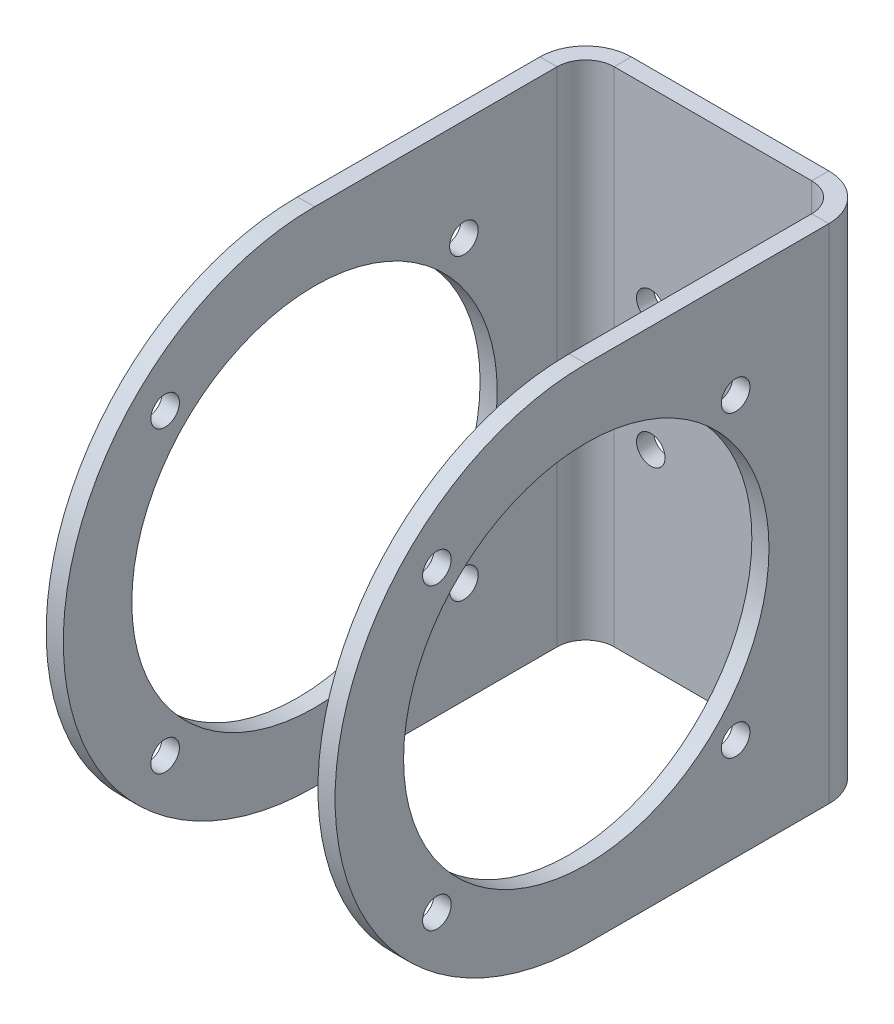
ISO-10303-21;
HEADER;
FILE_DESCRIPTION(('STEP AP214'),'2;1');
FILE_NAME('part.step','',(''),(''),'','','');
FILE_SCHEMA(('AUTOMOTIVE_DESIGN { 1 0 10303 214 1 1 1 1 }'));
ENDSEC;
DATA;
#1=APPLICATION_CONTEXT('core data for automotive mechanical design processes');
#2=APPLICATION_PROTOCOL_DEFINITION('international standard','automotive_design',2000,#1);
#3=PRODUCT_CONTEXT('',#1,'mechanical');
#4=PRODUCT('Part','Part','',(#3));
#5=PRODUCT_RELATED_PRODUCT_CATEGORY('part','',(#4));
#6=PRODUCT_DEFINITION_FORMATION('','',#4);
#7=PRODUCT_DEFINITION_CONTEXT('part definition',#1,'design');
#8=PRODUCT_DEFINITION('design','',#6,#7);
#9=PRODUCT_DEFINITION_SHAPE('','',#8);
#10=(LENGTH_UNIT() NAMED_UNIT(*) SI_UNIT(.MILLI.,.METRE.));
#11=(NAMED_UNIT(*) PLANE_ANGLE_UNIT() SI_UNIT($,.RADIAN.));
#12=(NAMED_UNIT(*) SI_UNIT($,.STERADIAN.) SOLID_ANGLE_UNIT());
#13=UNCERTAINTY_MEASURE_WITH_UNIT(LENGTH_MEASURE(1.E-05),#10,'distance_accuracy_value','');
#14=(GEOMETRIC_REPRESENTATION_CONTEXT(3) GLOBAL_UNCERTAINTY_ASSIGNED_CONTEXT((#13)) GLOBAL_UNIT_ASSIGNED_CONTEXT((#10,
#11,#12)) REPRESENTATION_CONTEXT('',''));
#15=CARTESIAN_POINT('',(0.,0.,0.));
#16=DIRECTION('',(0.,0.,1.));
#17=DIRECTION('',(1.,0.,0.));
#18=AXIS2_PLACEMENT_3D('',#15,#16,#17);
#19=CARTESIAN_POINT('',(-35.,22.,3.2));
#20=DIRECTION('',(0.,1.,0.));
#21=DIRECTION('',(-1.,0.,0.));
#22=AXIS2_PLACEMENT_3D('',#19,#20,#21);
#23=PLANE('',#22);
#24=DIRECTION('',(-1.,0.,0.));
#25=VECTOR('',#24,1.);
#26=CARTESIAN_POINT('',(-35.,22.,3.2));
#27=LINE('',#26,#25);
#28=CARTESIAN_POINT('',(8.65000000000001,22.,3.2));
#29=VERTEX_POINT('',#28);
#30=CARTESIAN_POINT('',(-8.65000000000001,22.,3.2));
#31=VERTEX_POINT('',#30);
#32=EDGE_CURVE('E318',#29,#31,#27,.T.);
#33=ORIENTED_EDGE('',*,*,#32,.F.);
#34=DIRECTION('',(0.,0.,-1.));
#35=VECTOR('',#34,1.);
#36=CARTESIAN_POINT('',(8.65000000000001,22.,3.2));
#37=LINE('',#36,#35);
#38=CARTESIAN_POINT('',(8.65000000000001,22.,1.7));
#39=VERTEX_POINT('',#38);
#40=EDGE_CURVE('E12',#29,#39,#37,.T.);
#41=ORIENTED_EDGE('',*,*,#40,.T.);
#42=DIRECTION('',(1.,0.,0.));
#43=VECTOR('',#42,1.);
#44=CARTESIAN_POINT('',(35.,22.,1.7));
#45=LINE('',#44,#43);
#46=CARTESIAN_POINT('',(-8.65000000000001,22.,1.7));
#47=VERTEX_POINT('',#46);
#48=EDGE_CURVE('E214',#39,#47,#45,.F.);
#49=ORIENTED_EDGE('',*,*,#48,.T.);
#50=DIRECTION('',(0.,0.,-1.));
#51=VECTOR('',#50,1.);
#52=CARTESIAN_POINT('',(-8.65000000000001,22.,3.2));
#53=LINE('',#52,#51);
#54=EDGE_CURVE('E243',#31,#47,#53,.T.);
#55=ORIENTED_EDGE('',*,*,#54,.F.);
#56=EDGE_LOOP('',(#33,#41,#49,#55));
#57=FACE_BOUND('',#56,.T.);
#58=ADVANCED_FACE('F47',(#57),#23,.T.);
#59=CARTESIAN_POINT('',(-35.,-22.,3.2));
#60=DIRECTION('',(0.,-1.,0.));
#61=DIRECTION('',(1.,0.,0.));
#62=AXIS2_PLACEMENT_3D('',#59,#60,#61);
#63=PLANE('',#62);
#64=DIRECTION('',(1.,0.,0.));
#65=VECTOR('',#64,1.);
#66=CARTESIAN_POINT('',(35.,-22.,1.7));
#67=LINE('',#66,#65);
#68=CARTESIAN_POINT('',(-8.65000000000001,-22.,1.7));
#69=VERTEX_POINT('',#68);
#70=CARTESIAN_POINT('',(8.65000000000002,-22.,1.7));
#71=VERTEX_POINT('',#70);
#72=EDGE_CURVE('E227',#69,#71,#67,.T.);
#73=ORIENTED_EDGE('',*,*,#72,.T.);
#74=DIRECTION('',(0.,0.,1.));
#75=VECTOR('',#74,1.);
#76=CARTESIAN_POINT('',(8.65000000000002,-22.,3.2));
#77=LINE('',#76,#75);
#78=CARTESIAN_POINT('',(8.65000000000002,-22.,3.2));
#79=VERTEX_POINT('',#78);
#80=EDGE_CURVE('E312',#71,#79,#77,.T.);
#81=ORIENTED_EDGE('',*,*,#80,.T.);
#82=DIRECTION('',(1.,0.,0.));
#83=VECTOR('',#82,1.);
#84=CARTESIAN_POINT('',(-35.,-22.,3.2));
#85=LINE('',#84,#83);
#86=CARTESIAN_POINT('',(-8.65,-22.,3.2));
#87=VERTEX_POINT('',#86);
#88=EDGE_CURVE('E50',#87,#79,#85,.T.);
#89=ORIENTED_EDGE('',*,*,#88,.F.);
#90=DIRECTION('',(0.,0.,1.));
#91=VECTOR('',#90,1.);
#92=CARTESIAN_POINT('',(-8.65,-22.,3.2));
#93=LINE('',#92,#91);
#94=EDGE_CURVE('E240',#69,#87,#93,.T.);
#95=ORIENTED_EDGE('',*,*,#94,.F.);
#96=EDGE_LOOP('',(#73,#81,#89,#95));
#97=FACE_BOUND('',#96,.T.);
#98=ADVANCED_FACE('F328',(#97),#63,.T.);
#99=CARTESIAN_POINT('',(35.,0.,3.2));
#100=DIRECTION('',(0.,0.,1.));
#101=DIRECTION('',(1.,0.,0.));
#102=AXIS2_PLACEMENT_3D('',#99,#100,#101);
#103=PLANE('',#102);
#104=CARTESIAN_POINT('',(-5.44472221513639,-5.44472221513645,3.2));
#105=DIRECTION('',(0.,0.,1.));
#106=DIRECTION('',(1.,0.,0.));
#107=AXIS2_PLACEMENT_3D('',#104,#105,#106);
#108=CIRCLE('',#107,1.25);
#109=CARTESIAN_POINT('',(-4.19472221513639,-5.44472221513645,3.2));
#110=VERTEX_POINT('',#109);
#111=EDGE_CURVE('E237',#110,#110,#108,.T.);
#112=ORIENTED_EDGE('',*,*,#111,.F.);
#113=EDGE_LOOP('',(#112));
#114=FACE_BOUND('',#113,.T.);
#115=CARTESIAN_POINT('',(5.44472221513639,5.44472221513645,3.2));
#116=DIRECTION('',(0.,0.,1.));
#117=DIRECTION('',(1.,0.,0.));
#118=AXIS2_PLACEMENT_3D('',#115,#116,#117);
#119=CIRCLE('',#118,1.25);
#120=CARTESIAN_POINT('',(6.69472221513638,5.44472221513645,3.2));
#121=VERTEX_POINT('',#120);
#122=EDGE_CURVE('E234',#121,#121,#119,.T.);
#123=ORIENTED_EDGE('',*,*,#122,.F.);
#124=EDGE_LOOP('',(#123));
#125=FACE_BOUND('',#124,.T.);
#126=CARTESIAN_POINT('',(-5.44472221513645,5.44472221513639,3.2));
#127=DIRECTION('',(0.,0.,1.));
#128=DIRECTION('',(1.,0.,0.));
#129=AXIS2_PLACEMENT_3D('',#126,#127,#128);
#130=CIRCLE('',#129,1.25);
#131=CARTESIAN_POINT('',(-4.19472221513645,5.44472221513639,3.2));
#132=VERTEX_POINT('',#131);
#133=EDGE_CURVE('E231',#132,#132,#130,.T.);
#134=ORIENTED_EDGE('',*,*,#133,.F.);
#135=EDGE_LOOP('',(#134));
#136=FACE_BOUND('',#135,.T.);
#137=CARTESIAN_POINT('',(5.44472221513645,-5.44472221513639,3.2));
#138=DIRECTION('',(0.,0.,1.));
#139=DIRECTION('',(1.,0.,0.));
#140=AXIS2_PLACEMENT_3D('',#137,#138,#139);
#141=CIRCLE('',#140,1.25);
#142=CARTESIAN_POINT('',(6.69472221513645,-5.44472221513639,3.2));
#143=VERTEX_POINT('',#142);
#144=EDGE_CURVE('E228',#143,#143,#141,.T.);
#145=ORIENTED_EDGE('',*,*,#144,.F.);
#146=EDGE_LOOP('',(#145));
#147=FACE_BOUND('',#146,.T.);
#148=ORIENTED_EDGE('',*,*,#88,.T.);
#149=DIRECTION('',(0.,1.,0.));
#150=VECTOR('',#149,1.);
#151=CARTESIAN_POINT('',(8.65000000000001,0.,3.2));
#152=LINE('',#151,#150);
#153=EDGE_CURVE('E303',#79,#29,#152,.T.);
#154=ORIENTED_EDGE('',*,*,#153,.T.);
#155=ORIENTED_EDGE('',*,*,#32,.T.);
#156=DIRECTION('',(0.,1.,0.));
#157=VECTOR('',#156,1.);
#158=CARTESIAN_POINT('',(-8.65000000000001,0.,3.2));
#159=LINE('',#158,#157);
#160=EDGE_CURVE('E206',#87,#31,#159,.T.);
#161=ORIENTED_EDGE('',*,*,#160,.F.);
#162=EDGE_LOOP('',(#148,#154,#155,#161));
#163=FACE_BOUND('',#162,.T.);
#164=ADVANCED_FACE('F324',(#114,#125,#136,#147,#163),#103,.T.);
#165=CARTESIAN_POINT('',(-11.1499999999999,-22.,26.9449119379166));
#166=DIRECTION('',(0.,-1.,0.));
#167=DIRECTION('',(0.,0.,-1.));
#168=AXIS2_PLACEMENT_3D('',#165,#166,#167);
#169=PLANE('',#168);
#170=DIRECTION('',(0.,0.,-1.));
#171=VECTOR('',#170,1.);
#172=CARTESIAN_POINT('',(-12.6500000000002,-22.,-43.0550880620834));
#173=LINE('',#172,#171);
#174=CARTESIAN_POINT('',(-12.6499999999999,-22.,26.9449119379166));
#175=VERTEX_POINT('',#174);
#176=CARTESIAN_POINT('',(-12.65,-22.,5.70000000000001));
#177=VERTEX_POINT('',#176);
#178=EDGE_CURVE('E282',#175,#177,#173,.T.);
#179=ORIENTED_EDGE('',*,*,#178,.T.);
#180=DIRECTION('',(1.,0.,0.));
#181=VECTOR('',#180,1.);
#182=CARTESIAN_POINT('',(-11.15,-22.,5.70000000000001));
#183=LINE('',#182,#181);
#184=CARTESIAN_POINT('',(-11.15,-22.,5.70000000000001));
#185=VERTEX_POINT('',#184);
#186=EDGE_CURVE('E295',#177,#185,#183,.T.);
#187=ORIENTED_EDGE('',*,*,#186,.T.);
#188=DIRECTION('',(0.,0.,-1.));
#189=VECTOR('',#188,1.);
#190=CARTESIAN_POINT('',(-11.1499999999999,-22.,26.9449119379166));
#191=LINE('',#190,#189);
#192=CARTESIAN_POINT('',(-11.1499999999999,-22.,26.9449119379166));
#193=VERTEX_POINT('',#192);
#194=EDGE_CURVE('E261',#193,#185,#191,.T.);
#195=ORIENTED_EDGE('',*,*,#194,.F.);
#196=DIRECTION('',(1.,0.,0.));
#197=VECTOR('',#196,1.);
#198=CARTESIAN_POINT('',(-11.1499999999999,-22.,26.9449119379166));
#199=LINE('',#198,#197);
#200=EDGE_CURVE('E268',#175,#193,#199,.T.);
#201=ORIENTED_EDGE('',*,*,#200,.F.);
#202=EDGE_LOOP('',(#179,#187,#195,#201));
#203=FACE_BOUND('',#202,.T.);
#204=ADVANCED_FACE('F386',(#203),#169,.T.);
#205=CARTESIAN_POINT('',(-11.1499999999999,22.,26.9449119379166));
#206=DIRECTION('',(0.,1.,0.));
#207=DIRECTION('',(0.,0.,1.));
#208=AXIS2_PLACEMENT_3D('',#205,#206,#207);
#209=PLANE('',#208);
#210=DIRECTION('',(0.,0.,1.));
#211=VECTOR('',#210,1.);
#212=CARTESIAN_POINT('',(-11.1499999999999,22.,26.9449119379166));
#213=LINE('',#212,#211);
#214=CARTESIAN_POINT('',(-11.15,22.,5.70000000000001));
#215=VERTEX_POINT('',#214);
#216=CARTESIAN_POINT('',(-11.1499999999999,22.,26.9449119379166));
#217=VERTEX_POINT('',#216);
#218=EDGE_CURVE('E257',#215,#217,#213,.T.);
#219=ORIENTED_EDGE('',*,*,#218,.F.);
#220=DIRECTION('',(-1.,0.,0.));
#221=VECTOR('',#220,1.);
#222=CARTESIAN_POINT('',(-11.15,22.,5.70000000000001));
#223=LINE('',#222,#221);
#224=CARTESIAN_POINT('',(-12.65,22.,5.70000000000001));
#225=VERTEX_POINT('',#224);
#226=EDGE_CURVE('E300',#215,#225,#223,.T.);
#227=ORIENTED_EDGE('',*,*,#226,.T.);
#228=DIRECTION('',(0.,0.,-1.));
#229=VECTOR('',#228,1.);
#230=CARTESIAN_POINT('',(-12.6500000000002,22.,-43.0550880620834));
#231=LINE('',#230,#229);
#232=CARTESIAN_POINT('',(-12.6499999999999,22.,26.9449119379166));
#233=VERTEX_POINT('',#232);
#234=EDGE_CURVE('E278',#225,#233,#231,.F.);
#235=ORIENTED_EDGE('',*,*,#234,.T.);
#236=DIRECTION('',(1.,0.,0.));
#237=VECTOR('',#236,1.);
#238=CARTESIAN_POINT('',(-11.1499999999999,22.,26.9449119379166));
#239=LINE('',#238,#237);
#240=EDGE_CURVE('E289',#233,#217,#239,.T.);
#241=ORIENTED_EDGE('',*,*,#240,.T.);
#242=EDGE_LOOP('',(#219,#227,#235,#241));
#243=FACE_BOUND('',#242,.T.);
#244=ADVANCED_FACE('F379',(#243),#209,.T.);
#245=CARTESIAN_POINT('',(-11.1500000000002,0.,-43.0550880620834));
#246=DIRECTION('',(1.,0.,0.));
#247=DIRECTION('',(0.,0.,-1.));
#248=AXIS2_PLACEMENT_3D('',#245,#246,#247);
#249=PLANE('',#248);
#250=CARTESIAN_POINT('',(-11.15,-13.0814754519511,13.8634364859655));
#251=DIRECTION('',(1.,0.,0.));
#252=DIRECTION('',(0.,0.,-1.));
#253=AXIS2_PLACEMENT_3D('',#250,#251,#252);
#254=CIRCLE('',#253,1.24999999999999);
#255=CARTESIAN_POINT('',(-11.15,-13.0814754519511,12.6134364859655));
#256=VERTEX_POINT('',#255);
#257=EDGE_CURVE('E265',#256,#256,#254,.T.);
#258=ORIENTED_EDGE('',*,*,#257,.F.);
#259=EDGE_LOOP('',(#258));
#260=FACE_BOUND('',#259,.T.);
#261=CARTESIAN_POINT('',(-11.1499999999999,13.0814754519512,40.0263873898677));
#262=DIRECTION('',(1.,0.,0.));
#263=DIRECTION('',(0.,0.,-1.));
#264=AXIS2_PLACEMENT_3D('',#261,#262,#263);
#265=CIRCLE('',#264,1.25);
#266=CARTESIAN_POINT('',(-11.1499999999999,13.0814754519512,38.7763873898677));
#267=VERTEX_POINT('',#266);
#268=EDGE_CURVE('E262',#267,#267,#265,.T.);
#269=ORIENTED_EDGE('',*,*,#268,.F.);
#270=EDGE_LOOP('',(#269));
#271=FACE_BOUND('',#270,.T.);
#272=CARTESIAN_POINT('',(-11.1499999999999,0.,26.9449119379166));
#273=DIRECTION('',(1.,0.,0.));
#274=DIRECTION('',(0.,0.,-1.));
#275=AXIS2_PLACEMENT_3D('',#272,#273,#274);
#276=CIRCLE('',#275,16.);
#277=CARTESIAN_POINT('',(-11.15,0.,10.9449119379166));
#278=VERTEX_POINT('',#277);
#279=EDGE_CURVE('E254',#278,#278,#276,.T.);
#280=ORIENTED_EDGE('',*,*,#279,.F.);
#281=EDGE_LOOP('',(#280));
#282=FACE_BOUND('',#281,.T.);
#283=CARTESIAN_POINT('',(-11.15,13.0814754519511,13.8634364859654));
#284=DIRECTION('',(1.,0.,0.));
#285=DIRECTION('',(0.,0.,-1.));
#286=AXIS2_PLACEMENT_3D('',#283,#284,#285);
#287=CIRCLE('',#286,1.24999999999999);
#288=CARTESIAN_POINT('',(-11.15,13.0814754519511,12.6134364859654));
#289=VERTEX_POINT('',#288);
#290=EDGE_CURVE('E250',#289,#289,#287,.T.);
#291=ORIENTED_EDGE('',*,*,#290,.F.);
#292=EDGE_LOOP('',(#291));
#293=FACE_BOUND('',#292,.T.);
#294=CARTESIAN_POINT('',(-11.1499999999999,-13.0814754519511,40.0263873898677));
#295=DIRECTION('',(1.,0.,0.));
#296=DIRECTION('',(0.,0.,-1.));
#297=AXIS2_PLACEMENT_3D('',#294,#295,#296);
#298=CIRCLE('',#297,1.24999999999999);
#299=CARTESIAN_POINT('',(-11.1499999999999,-13.0814754519511,38.7763873898677));
#300=VERTEX_POINT('',#299);
#301=EDGE_CURVE('E247',#300,#300,#298,.T.);
#302=ORIENTED_EDGE('',*,*,#301,.F.);
#303=EDGE_LOOP('',(#302));
#304=FACE_BOUND('',#303,.T.);
#305=ORIENTED_EDGE('',*,*,#194,.T.);
#306=DIRECTION('',(0.,1.,0.));
#307=VECTOR('',#306,1.);
#308=CARTESIAN_POINT('',(-11.15,0.,5.70000000000001));
#309=LINE('',#308,#307);
#310=EDGE_CURVE('E292',#185,#215,#309,.T.);
#311=ORIENTED_EDGE('',*,*,#310,.T.);
#312=ORIENTED_EDGE('',*,*,#218,.T.);
#313=CARTESIAN_POINT('',(-11.1499999999999,0.,26.9449119379166));
#314=DIRECTION('',(1.,0.,0.));
#315=DIRECTION('',(0.,0.,1.));
#316=AXIS2_PLACEMENT_3D('',#313,#314,#315);
#317=CIRCLE('',#316,22.);
#318=EDGE_CURVE('E258',#217,#193,#317,.T.);
#319=ORIENTED_EDGE('',*,*,#318,.T.);
#320=EDGE_LOOP('',(#305,#311,#312,#319));
#321=FACE_BOUND('',#320,.T.);
#322=ADVANCED_FACE('F377',(#260,#271,#282,#293,#304,#321),#249,.T.);
#323=CARTESIAN_POINT('',(-11.1499999999999,0.,26.9449119379166));
#324=DIRECTION('',(1.,0.,0.));
#325=DIRECTION('',(0.,0.,-1.));
#326=AXIS2_PLACEMENT_3D('',#323,#324,#325);
#327=CYLINDRICAL_SURFACE('',#326,22.);
#328=ORIENTED_EDGE('',*,*,#240,.F.);
#329=CARTESIAN_POINT('',(-12.6499999999999,0.,26.9449119379166));
#330=DIRECTION('',(1.,0.,0.));
#331=DIRECTION('',(0.,0.,-1.));
#332=AXIS2_PLACEMENT_3D('',#329,#330,#331);
#333=CIRCLE('',#332,22.);
#334=EDGE_CURVE('E279',#233,#175,#333,.T.);
#335=ORIENTED_EDGE('',*,*,#334,.T.);
#336=ORIENTED_EDGE('',*,*,#200,.T.);
#337=ORIENTED_EDGE('',*,*,#318,.F.);
#338=EDGE_LOOP('',(#328,#335,#336,#337));
#339=FACE_BOUND('',#338,.T.);
#340=ADVANCED_FACE('F384',(#339),#327,.T.);
#341=CARTESIAN_POINT('',(-11.1499999999999,-13.0814754519511,40.0263873898677));
#342=DIRECTION('',(1.,0.,0.));
#343=DIRECTION('',(0.,0.,-1.));
#344=AXIS2_PLACEMENT_3D('',#341,#342,#343);
#345=CYLINDRICAL_SURFACE('',#344,1.24999999999999);
#346=ORIENTED_EDGE('',*,*,#301,.T.);
#347=EDGE_LOOP('',(#346));
#348=FACE_BOUND('',#347,.T.);
#349=CARTESIAN_POINT('',(-12.6499999999999,-13.0814754519511,40.0263873898677));
#350=DIRECTION('',(1.,0.,0.));
#351=DIRECTION('',(0.,0.,-1.));
#352=AXIS2_PLACEMENT_3D('',#349,#350,#351);
#353=CIRCLE('',#352,1.24999999999999);
#354=CARTESIAN_POINT('',(-12.6499999999999,-13.0814754519511,38.7763873898677));
#355=VERTEX_POINT('',#354);
#356=EDGE_CURVE('E269',#355,#355,#353,.T.);
#357=ORIENTED_EDGE('',*,*,#356,.F.);
#358=EDGE_LOOP('',(#357));
#359=FACE_BOUND('',#358,.T.);
#360=ADVANCED_FACE('F455',(#348,#359),#345,.F.);
#361=CARTESIAN_POINT('',(-11.15,13.0814754519511,13.8634364859654));
#362=DIRECTION('',(1.,0.,0.));
#363=DIRECTION('',(0.,0.,-1.));
#364=AXIS2_PLACEMENT_3D('',#361,#362,#363);
#365=CYLINDRICAL_SURFACE('',#364,1.24999999999999);
#366=ORIENTED_EDGE('',*,*,#290,.T.);
#367=EDGE_LOOP('',(#366));
#368=FACE_BOUND('',#367,.T.);
#369=CARTESIAN_POINT('',(-12.65,13.0814754519511,13.8634364859654));
#370=DIRECTION('',(1.,0.,0.));
#371=DIRECTION('',(0.,0.,-1.));
#372=AXIS2_PLACEMENT_3D('',#369,#370,#371);
#373=CIRCLE('',#372,1.24999999999999);
#374=CARTESIAN_POINT('',(-12.65,13.0814754519511,12.6134364859654));
#375=VERTEX_POINT('',#374);
#376=EDGE_CURVE('E272',#375,#375,#373,.T.);
#377=ORIENTED_EDGE('',*,*,#376,.F.);
#378=EDGE_LOOP('',(#377));
#379=FACE_BOUND('',#378,.T.);
#380=ADVANCED_FACE('F458',(#368,#379),#365,.F.);
#381=CARTESIAN_POINT('',(-11.1499999999999,0.,26.9449119379166));
#382=DIRECTION('',(1.,0.,0.));
#383=DIRECTION('',(0.,0.,-1.));
#384=AXIS2_PLACEMENT_3D('',#381,#382,#383);
#385=CYLINDRICAL_SURFACE('',#384,16.);
#386=ORIENTED_EDGE('',*,*,#279,.T.);
#387=EDGE_LOOP('',(#386));
#388=FACE_BOUND('',#387,.T.);
#389=CARTESIAN_POINT('',(-12.6499999999999,0.,26.9449119379166));
#390=DIRECTION('',(1.,0.,0.));
#391=DIRECTION('',(0.,0.,-1.));
#392=AXIS2_PLACEMENT_3D('',#389,#390,#391);
#393=CIRCLE('',#392,16.);
#394=CARTESIAN_POINT('',(-12.65,0.,10.9449119379166));
#395=VERTEX_POINT('',#394);
#396=EDGE_CURVE('E275',#395,#395,#393,.T.);
#397=ORIENTED_EDGE('',*,*,#396,.F.);
#398=EDGE_LOOP('',(#397));
#399=FACE_BOUND('',#398,.T.);
#400=ADVANCED_FACE('F451',(#388,#399),#385,.F.);
#401=CARTESIAN_POINT('',(-11.1499999999999,13.0814754519512,40.0263873898677));
#402=DIRECTION('',(1.,0.,0.));
#403=DIRECTION('',(0.,0.,-1.));
#404=AXIS2_PLACEMENT_3D('',#401,#402,#403);
#405=CYLINDRICAL_SURFACE('',#404,1.25);
#406=ORIENTED_EDGE('',*,*,#268,.T.);
#407=EDGE_LOOP('',(#406));
#408=FACE_BOUND('',#407,.T.);
#409=CARTESIAN_POINT('',(-12.6499999999999,13.0814754519512,40.0263873898677));
#410=DIRECTION('',(1.,0.,0.));
#411=DIRECTION('',(0.,0.,-1.));
#412=AXIS2_PLACEMENT_3D('',#409,#410,#411);
#413=CIRCLE('',#412,1.25);
#414=CARTESIAN_POINT('',(-12.6499999999999,13.0814754519512,38.7763873898677));
#415=VERTEX_POINT('',#414);
#416=EDGE_CURVE('E283',#415,#415,#413,.T.);
#417=ORIENTED_EDGE('',*,*,#416,.F.);
#418=EDGE_LOOP('',(#417));
#419=FACE_BOUND('',#418,.T.);
#420=ADVANCED_FACE('F447',(#408,#419),#405,.F.);
#421=CARTESIAN_POINT('',(-11.15,-13.0814754519511,13.8634364859655));
#422=DIRECTION('',(1.,0.,0.));
#423=DIRECTION('',(0.,0.,-1.));
#424=AXIS2_PLACEMENT_3D('',#421,#422,#423);
#425=CYLINDRICAL_SURFACE('',#424,1.24999999999999);
#426=ORIENTED_EDGE('',*,*,#257,.T.);
#427=EDGE_LOOP('',(#426));
#428=FACE_BOUND('',#427,.T.);
#429=CARTESIAN_POINT('',(-12.65,-13.0814754519511,13.8634364859655));
#430=DIRECTION('',(1.,0.,0.));
#431=DIRECTION('',(0.,0.,-1.));
#432=AXIS2_PLACEMENT_3D('',#429,#430,#431);
#433=CIRCLE('',#432,1.24999999999999);
#434=CARTESIAN_POINT('',(-12.65,-13.0814754519511,12.6134364859655));
#435=VERTEX_POINT('',#434);
#436=EDGE_CURVE('E251',#435,#435,#433,.T.);
#437=ORIENTED_EDGE('',*,*,#436,.F.);
#438=EDGE_LOOP('',(#437));
#439=FACE_BOUND('',#438,.T.);
#440=ADVANCED_FACE('F438',(#428,#439),#425,.F.);
#441=CARTESIAN_POINT('',(-12.6500000000002,0.,-43.0550880620834));
#442=DIRECTION('',(1.,0.,0.));
#443=DIRECTION('',(0.,0.,-1.));
#444=AXIS2_PLACEMENT_3D('',#441,#442,#443);
#445=PLANE('',#444);
#446=DIRECTION('',(0.,1.,0.));
#447=VECTOR('',#446,1.);
#448=CARTESIAN_POINT('',(-12.65,0.,5.70000000000002));
#449=LINE('',#448,#447);
#450=EDGE_CURVE('E298',#177,#225,#449,.T.);
#451=ORIENTED_EDGE('',*,*,#450,.F.);
#452=ORIENTED_EDGE('',*,*,#178,.F.);
#453=ORIENTED_EDGE('',*,*,#334,.F.);
#454=ORIENTED_EDGE('',*,*,#234,.F.);
#455=EDGE_LOOP('',(#451,#452,#453,#454));
#456=FACE_BOUND('',#455,.T.);
#457=ORIENTED_EDGE('',*,*,#356,.T.);
#458=EDGE_LOOP('',(#457));
#459=FACE_BOUND('',#458,.T.);
#460=ORIENTED_EDGE('',*,*,#376,.T.);
#461=EDGE_LOOP('',(#460));
#462=FACE_BOUND('',#461,.T.);
#463=ORIENTED_EDGE('',*,*,#396,.T.);
#464=EDGE_LOOP('',(#463));
#465=FACE_BOUND('',#464,.T.);
#466=ORIENTED_EDGE('',*,*,#416,.T.);
#467=EDGE_LOOP('',(#466));
#468=FACE_BOUND('',#467,.T.);
#469=ORIENTED_EDGE('',*,*,#436,.T.);
#470=EDGE_LOOP('',(#469));
#471=FACE_BOUND('',#470,.T.);
#472=ADVANCED_FACE('F434',(#456,#459,#462,#465,#468,#471),#445,.F.);
#473=CARTESIAN_POINT('',(-5.44472221513639,-5.44472221513645,3.2));
#474=DIRECTION('',(0.,0.,1.));
#475=DIRECTION('',(1.,0.,0.));
#476=AXIS2_PLACEMENT_3D('',#473,#474,#475);
#477=CYLINDRICAL_SURFACE('',#476,1.25);
#478=ORIENTED_EDGE('',*,*,#111,.T.);
#479=EDGE_LOOP('',(#478));
#480=FACE_BOUND('',#479,.T.);
#481=CARTESIAN_POINT('',(-5.44472221513639,-5.44472221513645,1.7));
#482=DIRECTION('',(0.,0.,1.));
#483=DIRECTION('',(1.,0.,0.));
#484=AXIS2_PLACEMENT_3D('',#481,#482,#483);
#485=CIRCLE('',#484,1.25);
#486=CARTESIAN_POINT('',(-4.19472221513639,-5.44472221513645,1.7));
#487=VERTEX_POINT('',#486);
#488=EDGE_CURVE('E224',#487,#487,#485,.T.);
#489=ORIENTED_EDGE('',*,*,#488,.F.);
#490=EDGE_LOOP('',(#489));
#491=FACE_BOUND('',#490,.T.);
#492=ADVANCED_FACE('F437',(#480,#491),#477,.F.);
#493=CARTESIAN_POINT('',(5.44472221513639,5.44472221513645,3.2));
#494=DIRECTION('',(0.,0.,1.));
#495=DIRECTION('',(1.,0.,0.));
#496=AXIS2_PLACEMENT_3D('',#493,#494,#495);
#497=CYLINDRICAL_SURFACE('',#496,1.25);
#498=ORIENTED_EDGE('',*,*,#122,.T.);
#499=EDGE_LOOP('',(#498));
#500=FACE_BOUND('',#499,.T.);
#501=CARTESIAN_POINT('',(5.44472221513639,5.44472221513645,1.7));
#502=DIRECTION('',(0.,0.,1.));
#503=DIRECTION('',(1.,0.,0.));
#504=AXIS2_PLACEMENT_3D('',#501,#502,#503);
#505=CIRCLE('',#504,1.25);
#506=CARTESIAN_POINT('',(6.69472221513638,5.44472221513645,1.7));
#507=VERTEX_POINT('',#506);
#508=EDGE_CURVE('E221',#507,#507,#505,.T.);
#509=ORIENTED_EDGE('',*,*,#508,.F.);
#510=EDGE_LOOP('',(#509));
#511=FACE_BOUND('',#510,.T.);
#512=ADVANCED_FACE('F416',(#500,#511),#497,.F.);
#513=CARTESIAN_POINT('',(-5.44472221513645,5.44472221513639,3.2));
#514=DIRECTION('',(0.,0.,1.));
#515=DIRECTION('',(1.,0.,0.));
#516=AXIS2_PLACEMENT_3D('',#513,#514,#515);
#517=CYLINDRICAL_SURFACE('',#516,1.25);
#518=ORIENTED_EDGE('',*,*,#133,.T.);
#519=EDGE_LOOP('',(#518));
#520=FACE_BOUND('',#519,.T.);
#521=CARTESIAN_POINT('',(-5.44472221513645,5.44472221513639,1.7));
#522=DIRECTION('',(0.,0.,1.));
#523=DIRECTION('',(1.,0.,0.));
#524=AXIS2_PLACEMENT_3D('',#521,#522,#523);
#525=CIRCLE('',#524,1.25);
#526=CARTESIAN_POINT('',(-4.19472221513645,5.44472221513639,1.7));
#527=VERTEX_POINT('',#526);
#528=EDGE_CURVE('E218',#527,#527,#525,.T.);
#529=ORIENTED_EDGE('',*,*,#528,.F.);
#530=EDGE_LOOP('',(#529));
#531=FACE_BOUND('',#530,.T.);
#532=ADVANCED_FACE('F409',(#520,#531),#517,.F.);
#533=CARTESIAN_POINT('',(5.44472221513645,-5.44472221513639,3.2));
#534=DIRECTION('',(0.,0.,1.));
#535=DIRECTION('',(1.,0.,0.));
#536=AXIS2_PLACEMENT_3D('',#533,#534,#535);
#537=CYLINDRICAL_SURFACE('',#536,1.25);
#538=ORIENTED_EDGE('',*,*,#144,.T.);
#539=EDGE_LOOP('',(#538));
#540=FACE_BOUND('',#539,.T.);
#541=CARTESIAN_POINT('',(5.44472221513645,-5.44472221513639,1.7));
#542=DIRECTION('',(0.,0.,1.));
#543=DIRECTION('',(1.,0.,0.));
#544=AXIS2_PLACEMENT_3D('',#541,#542,#543);
#545=CIRCLE('',#544,1.25);
#546=CARTESIAN_POINT('',(6.69472221513645,-5.44472221513639,1.7));
#547=VERTEX_POINT('',#546);
#548=EDGE_CURVE('E215',#547,#547,#545,.T.);
#549=ORIENTED_EDGE('',*,*,#548,.F.);
#550=EDGE_LOOP('',(#549));
#551=FACE_BOUND('',#550,.T.);
#552=ADVANCED_FACE('F399',(#540,#551),#537,.F.);
#553=CARTESIAN_POINT('',(35.,0.,1.7));
#554=DIRECTION('',(0.,0.,1.));
#555=DIRECTION('',(1.,0.,0.));
#556=AXIS2_PLACEMENT_3D('',#553,#554,#555);
#557=PLANE('',#556);
#558=DIRECTION('',(0.,1.,0.));
#559=VECTOR('',#558,1.);
#560=CARTESIAN_POINT('',(8.65000000000001,0.,1.7));
#561=LINE('',#560,#559);
#562=EDGE_CURVE('E55',#71,#39,#561,.T.);
#563=ORIENTED_EDGE('',*,*,#562,.F.);
#564=ORIENTED_EDGE('',*,*,#72,.F.);
#565=DIRECTION('',(0.,1.,0.));
#566=VECTOR('',#565,1.);
#567=CARTESIAN_POINT('',(-8.65000000000001,0.,1.7));
#568=LINE('',#567,#566);
#569=EDGE_CURVE('E211',#69,#47,#568,.T.);
#570=ORIENTED_EDGE('',*,*,#569,.T.);
#571=ORIENTED_EDGE('',*,*,#48,.F.);
#572=EDGE_LOOP('',(#563,#564,#570,#571));
#573=FACE_BOUND('',#572,.T.);
#574=ORIENTED_EDGE('',*,*,#488,.T.);
#575=EDGE_LOOP('',(#574));
#576=FACE_BOUND('',#575,.T.);
#577=ORIENTED_EDGE('',*,*,#508,.T.);
#578=EDGE_LOOP('',(#577));
#579=FACE_BOUND('',#578,.T.);
#580=ORIENTED_EDGE('',*,*,#528,.T.);
#581=EDGE_LOOP('',(#580));
#582=FACE_BOUND('',#581,.T.);
#583=ORIENTED_EDGE('',*,*,#548,.T.);
#584=EDGE_LOOP('',(#583));
#585=FACE_BOUND('',#584,.T.);
#586=ADVANCED_FACE('F396',(#573,#576,#579,#582,#585),#557,.F.);
#587=CARTESIAN_POINT('',(-8.65,-22.,5.7));
#588=DIRECTION('',(0.,1.,0.));
#589=DIRECTION('',(0.,0.,1.));
#590=AXIS2_PLACEMENT_3D('',#587,#588,#589);
#591=PLANE('',#590);
#592=ORIENTED_EDGE('',*,*,#186,.F.);
#593=CARTESIAN_POINT('',(-8.65,-22.,5.7));
#594=DIRECTION('',(0.,-1.,0.));
#595=DIRECTION('',(1.,0.,0.));
#596=AXIS2_PLACEMENT_3D('',#593,#594,#595);
#597=CIRCLE('',#596,4.);
#598=EDGE_CURVE('E197',#177,#69,#597,.T.);
#599=ORIENTED_EDGE('',*,*,#598,.T.);
#600=ORIENTED_EDGE('',*,*,#94,.T.);
#601=CARTESIAN_POINT('',(-8.65,-22.,5.7));
#602=DIRECTION('',(0.,-1.,0.));
#603=DIRECTION('',(0.,0.,-1.));
#604=AXIS2_PLACEMENT_3D('',#601,#602,#603);
#605=CIRCLE('',#604,2.5);
#606=EDGE_CURVE('E201',#185,#87,#605,.T.);
#607=ORIENTED_EDGE('',*,*,#606,.F.);
#608=EDGE_LOOP('',(#592,#599,#600,#607));
#609=FACE_BOUND('',#608,.T.);
#610=ADVANCED_FACE('F391',(#609),#591,.F.);
#611=CARTESIAN_POINT('',(-8.65000000000001,22.,5.7));
#612=DIRECTION('',(0.,-1.,0.));
#613=DIRECTION('',(0.,0.,-1.));
#614=AXIS2_PLACEMENT_3D('',#611,#612,#613);
#615=PLANE('',#614);
#616=CARTESIAN_POINT('',(-8.65000000000001,22.,5.7));
#617=DIRECTION('',(0.,-1.,0.));
#618=DIRECTION('',(1.,0.,0.));
#619=AXIS2_PLACEMENT_3D('',#616,#617,#618);
#620=CIRCLE('',#619,4.);
#621=EDGE_CURVE('E204',#47,#225,#620,.F.);
#622=ORIENTED_EDGE('',*,*,#621,.T.);
#623=ORIENTED_EDGE('',*,*,#226,.F.);
#624=CARTESIAN_POINT('',(-8.65000000000001,22.,5.7));
#625=DIRECTION('',(0.,1.,0.));
#626=DIRECTION('',(0.,0.,1.));
#627=AXIS2_PLACEMENT_3D('',#624,#625,#626);
#628=CIRCLE('',#627,2.5);
#629=EDGE_CURVE('E70',#31,#215,#628,.T.);
#630=ORIENTED_EDGE('',*,*,#629,.F.);
#631=ORIENTED_EDGE('',*,*,#54,.T.);
#632=EDGE_LOOP('',(#622,#623,#630,#631));
#633=FACE_BOUND('',#632,.T.);
#634=ADVANCED_FACE('F372',(#633),#615,.F.);
#635=CARTESIAN_POINT('',(-8.65000000000001,44.3205587072368,5.7));
#636=DIRECTION('',(0.,-1.,0.));
#637=DIRECTION('',(1.,0.,0.));
#638=AXIS2_PLACEMENT_3D('',#635,#636,#637);
#639=CYLINDRICAL_SURFACE('',#638,2.5);
#640=ORIENTED_EDGE('',*,*,#160,.T.);
#641=ORIENTED_EDGE('',*,*,#629,.T.);
#642=ORIENTED_EDGE('',*,*,#310,.F.);
#643=ORIENTED_EDGE('',*,*,#606,.T.);
#644=EDGE_LOOP('',(#640,#641,#642,#643));
#645=FACE_BOUND('',#644,.T.);
#646=ADVANCED_FACE('F370',(#645),#639,.F.);
#647=CARTESIAN_POINT('',(-8.65000000000001,44.3205587072368,5.7));
#648=DIRECTION('',(0.,-1.,0.));
#649=DIRECTION('',(1.,0.,0.));
#650=AXIS2_PLACEMENT_3D('',#647,#648,#649);
#651=CYLINDRICAL_SURFACE('',#650,4.);
#652=ORIENTED_EDGE('',*,*,#569,.F.);
#653=ORIENTED_EDGE('',*,*,#598,.F.);
#654=ORIENTED_EDGE('',*,*,#450,.T.);
#655=ORIENTED_EDGE('',*,*,#621,.F.);
#656=EDGE_LOOP('',(#652,#653,#654,#655));
#657=FACE_BOUND('',#656,.T.);
#658=ADVANCED_FACE('F394',(#657),#651,.T.);
#659=CARTESIAN_POINT('',(8.65000000000002,-22.,5.7));
#660=DIRECTION('',(0.,1.,0.));
#661=DIRECTION('',(-1.,0.,0.));
#662=AXIS2_PLACEMENT_3D('',#659,#660,#661);
#663=PLANE('',#662);
#664=ORIENTED_EDGE('',*,*,#80,.F.);
#665=CARTESIAN_POINT('',(8.65000000000002,-22.,5.7));
#666=DIRECTION('',(0.,1.,0.));
#667=DIRECTION('',(-1.,0.,0.));
#668=AXIS2_PLACEMENT_3D('',#665,#666,#667);
#669=CIRCLE('',#668,4.);
#670=CARTESIAN_POINT('',(12.65,-22.,5.70000000000001));
#671=VERTEX_POINT('',#670);
#672=EDGE_CURVE('E158',#71,#671,#669,.F.);
#673=ORIENTED_EDGE('',*,*,#672,.T.);
#674=DIRECTION('',(-1.,0.,0.));
#675=VECTOR('',#674,1.);
#676=CARTESIAN_POINT('',(11.15,-22.,5.70000000000001));
#677=LINE('',#676,#675);
#678=CARTESIAN_POINT('',(11.15,-22.,5.70000000000001));
#679=VERTEX_POINT('',#678);
#680=EDGE_CURVE('E182',#671,#679,#677,.T.);
#681=ORIENTED_EDGE('',*,*,#680,.T.);
#682=CARTESIAN_POINT('',(8.65000000000002,-22.,5.7));
#683=DIRECTION('',(0.,-1.,0.));
#684=DIRECTION('',(1.,0.,0.));
#685=AXIS2_PLACEMENT_3D('',#682,#683,#684);
#686=CIRCLE('',#685,2.5);
#687=EDGE_CURVE('E190',#79,#679,#686,.T.);
#688=ORIENTED_EDGE('',*,*,#687,.F.);
#689=EDGE_LOOP('',(#664,#673,#681,#688));
#690=FACE_BOUND('',#689,.T.);
#691=ADVANCED_FACE('F330',(#690),#663,.F.);
#692=CARTESIAN_POINT('',(8.65000000000001,22.,5.7));
#693=DIRECTION('',(0.,-1.,0.));
#694=DIRECTION('',(0.,0.,-1.));
#695=AXIS2_PLACEMENT_3D('',#692,#693,#694);
#696=PLANE('',#695);
#697=DIRECTION('',(1.,0.,0.));
#698=VECTOR('',#697,1.);
#699=CARTESIAN_POINT('',(11.15,22.,5.70000000000001));
#700=LINE('',#699,#698);
#701=CARTESIAN_POINT('',(11.15,22.,5.70000000000001));
#702=VERTEX_POINT('',#701);
#703=CARTESIAN_POINT('',(12.65,22.,5.70000000000002));
#704=VERTEX_POINT('',#703);
#705=EDGE_CURVE('E185',#702,#704,#700,.T.);
#706=ORIENTED_EDGE('',*,*,#705,.T.);
#707=CARTESIAN_POINT('',(8.65000000000001,22.,5.7));
#708=DIRECTION('',(0.,1.,0.));
#709=DIRECTION('',(-1.,0.,0.));
#710=AXIS2_PLACEMENT_3D('',#707,#708,#709);
#711=CIRCLE('',#710,4.);
#712=EDGE_CURVE('E194',#704,#39,#711,.T.);
#713=ORIENTED_EDGE('',*,*,#712,.T.);
#714=ORIENTED_EDGE('',*,*,#40,.F.);
#715=CARTESIAN_POINT('',(8.65000000000001,22.,5.7));
#716=DIRECTION('',(0.,1.,0.));
#717=DIRECTION('',(0.,0.,1.));
#718=AXIS2_PLACEMENT_3D('',#715,#716,#717);
#719=CIRCLE('',#718,2.5);
#720=EDGE_CURVE('E193',#702,#29,#719,.T.);
#721=ORIENTED_EDGE('',*,*,#720,.F.);
#722=EDGE_LOOP('',(#706,#713,#714,#721));
#723=FACE_BOUND('',#722,.T.);
#724=ADVANCED_FACE('F365',(#723),#696,.F.);
#725=CARTESIAN_POINT('',(8.65000000000002,-44.3205587072368,5.7));
#726=DIRECTION('',(0.,1.,0.));
#727=DIRECTION('',(-1.,0.,0.));
#728=AXIS2_PLACEMENT_3D('',#725,#726,#727);
#729=CYLINDRICAL_SURFACE('',#728,2.5);
#730=ORIENTED_EDGE('',*,*,#720,.T.);
#731=ORIENTED_EDGE('',*,*,#153,.F.);
#732=ORIENTED_EDGE('',*,*,#687,.T.);
#733=DIRECTION('',(0.,1.,0.));
#734=VECTOR('',#733,1.);
#735=CARTESIAN_POINT('',(11.15,0.,5.70000000000001));
#736=LINE('',#735,#734);
#737=EDGE_CURVE('E187',#679,#702,#736,.T.);
#738=ORIENTED_EDGE('',*,*,#737,.T.);
#739=EDGE_LOOP('',(#730,#731,#732,#738));
#740=FACE_BOUND('',#739,.T.);
#741=ADVANCED_FACE('F362',(#740),#729,.F.);
#742=CARTESIAN_POINT('',(8.65000000000002,-44.3205587072368,5.7));
#743=DIRECTION('',(0.,1.,0.));
#744=DIRECTION('',(-1.,0.,0.));
#745=AXIS2_PLACEMENT_3D('',#742,#743,#744);
#746=CYLINDRICAL_SURFACE('',#745,4.);
#747=ORIENTED_EDGE('',*,*,#712,.F.);
#748=DIRECTION('',(0.,1.,0.));
#749=VECTOR('',#748,1.);
#750=CARTESIAN_POINT('',(12.65,0.,5.70000000000002));
#751=LINE('',#750,#749);
#752=EDGE_CURVE('E156',#671,#704,#751,.T.);
#753=ORIENTED_EDGE('',*,*,#752,.F.);
#754=ORIENTED_EDGE('',*,*,#672,.F.);
#755=ORIENTED_EDGE('',*,*,#562,.T.);
#756=EDGE_LOOP('',(#747,#753,#754,#755));
#757=FACE_BOUND('',#756,.T.);
#758=ADVANCED_FACE('F331',(#757),#746,.T.);
#759=CARTESIAN_POINT('',(11.1499999999999,-13.0814754519511,40.0263873898677));
#760=DIRECTION('',(-1.,0.,0.));
#761=DIRECTION('',(0.,0.,1.));
#762=AXIS2_PLACEMENT_3D('',#759,#760,#761);
#763=CYLINDRICAL_SURFACE('',#762,1.24999999999999);
#764=CARTESIAN_POINT('',(11.1499999999999,-13.0814754519511,40.0263873898677));
#765=DIRECTION('',(-1.,0.,0.));
#766=DIRECTION('',(0.,0.,-1.));
#767=AXIS2_PLACEMENT_3D('',#764,#765,#766);
#768=CIRCLE('',#767,1.24999999999999);
#769=CARTESIAN_POINT('',(11.1499999999999,-13.0814754519511,38.7763873898678));
#770=VERTEX_POINT('',#769);
#771=EDGE_CURVE('E179',#770,#770,#768,.T.);
#772=ORIENTED_EDGE('',*,*,#771,.T.);
#773=EDGE_LOOP('',(#772));
#774=FACE_BOUND('',#773,.T.);
#775=CARTESIAN_POINT('',(12.6499999999999,-13.0814754519511,40.0263873898678));
#776=DIRECTION('',(-1.,0.,0.));
#777=DIRECTION('',(0.,0.,1.));
#778=AXIS2_PLACEMENT_3D('',#775,#776,#777);
#779=CIRCLE('',#778,1.24999999999999);
#780=CARTESIAN_POINT('',(12.6499999999999,-13.0814754519511,41.2763873898677));
#781=VERTEX_POINT('',#780);
#782=EDGE_CURVE('E332',#781,#781,#779,.T.);
#783=ORIENTED_EDGE('',*,*,#782,.F.);
#784=EDGE_LOOP('',(#783));
#785=FACE_BOUND('',#784,.T.);
#786=ADVANCED_FACE('F624',(#774,#785),#763,.F.);
#787=CARTESIAN_POINT('',(11.15,13.0814754519511,13.8634364859654));
#788=DIRECTION('',(-1.,0.,0.));
#789=DIRECTION('',(0.,0.,1.));
#790=AXIS2_PLACEMENT_3D('',#787,#788,#789);
#791=CYLINDRICAL_SURFACE('',#790,1.24999999999999);
#792=CARTESIAN_POINT('',(11.15,13.0814754519511,13.8634364859654));
#793=DIRECTION('',(-1.,0.,0.));
#794=DIRECTION('',(0.,0.,-1.));
#795=AXIS2_PLACEMENT_3D('',#792,#793,#794);
#796=CIRCLE('',#795,1.24999999999999);
#797=CARTESIAN_POINT('',(11.15,13.0814754519511,12.6134364859654));
#798=VERTEX_POINT('',#797);
#799=EDGE_CURVE('E176',#798,#798,#796,.T.);
#800=ORIENTED_EDGE('',*,*,#799,.T.);
#801=EDGE_LOOP('',(#800));
#802=FACE_BOUND('',#801,.T.);
#803=CARTESIAN_POINT('',(12.65,13.0814754519511,13.8634364859654));
#804=DIRECTION('',(-1.,0.,0.));
#805=DIRECTION('',(0.,0.,1.));
#806=AXIS2_PLACEMENT_3D('',#803,#804,#805);
#807=CIRCLE('',#806,1.24999999999999);
#808=CARTESIAN_POINT('',(12.65,13.0814754519511,15.1134364859654));
#809=VERTEX_POINT('',#808);
#810=EDGE_CURVE('E335',#809,#809,#807,.T.);
#811=ORIENTED_EDGE('',*,*,#810,.F.);
#812=EDGE_LOOP('',(#811));
#813=FACE_BOUND('',#812,.T.);
#814=ADVANCED_FACE('F630',(#802,#813),#791,.F.);
#815=CARTESIAN_POINT('',(11.1499999999999,0.,26.9449119379166));
#816=DIRECTION('',(-1.,0.,0.));
#817=DIRECTION('',(0.,0.,1.));
#818=AXIS2_PLACEMENT_3D('',#815,#816,#817);
#819=CYLINDRICAL_SURFACE('',#818,16.);
#820=CARTESIAN_POINT('',(11.1499999999999,0.,26.9449119379166));
#821=DIRECTION('',(-1.,0.,0.));
#822=DIRECTION('',(0.,0.,-1.));
#823=AXIS2_PLACEMENT_3D('',#820,#821,#822);
#824=CIRCLE('',#823,16.);
#825=CARTESIAN_POINT('',(11.15,0.,10.9449119379166));
#826=VERTEX_POINT('',#825);
#827=EDGE_CURVE('E173',#826,#826,#824,.T.);
#828=ORIENTED_EDGE('',*,*,#827,.T.);
#829=EDGE_LOOP('',(#828));
#830=FACE_BOUND('',#829,.T.);
#831=CARTESIAN_POINT('',(12.6499999999999,0.,26.9449119379166));
#832=DIRECTION('',(-1.,0.,0.));
#833=DIRECTION('',(0.,0.,1.));
#834=AXIS2_PLACEMENT_3D('',#831,#832,#833);
#835=CIRCLE('',#834,16.);
#836=CARTESIAN_POINT('',(12.6499999999999,0.,42.9449119379166));
#837=VERTEX_POINT('',#836);
#838=EDGE_CURVE('E340',#837,#837,#835,.T.);
#839=ORIENTED_EDGE('',*,*,#838,.F.);
#840=EDGE_LOOP('',(#839));
#841=FACE_BOUND('',#840,.T.);
#842=ADVANCED_FACE('F643',(#830,#841),#819,.F.);
#843=CARTESIAN_POINT('',(11.15,-13.0814754519511,13.8634364859655));
#844=DIRECTION('',(-1.,0.,0.));
#845=DIRECTION('',(0.,0.,1.));
#846=AXIS2_PLACEMENT_3D('',#843,#844,#845);
#847=CYLINDRICAL_SURFACE('',#846,1.24999999999999);
#848=CARTESIAN_POINT('',(11.15,-13.0814754519511,13.8634364859655));
#849=DIRECTION('',(-1.,0.,0.));
#850=DIRECTION('',(0.,0.,-1.));
#851=AXIS2_PLACEMENT_3D('',#848,#849,#850);
#852=CIRCLE('',#851,1.24999999999999);
#853=CARTESIAN_POINT('',(11.15,-13.0814754519511,12.6134364859655));
#854=VERTEX_POINT('',#853);
#855=EDGE_CURVE('E167',#854,#854,#852,.T.);
#856=ORIENTED_EDGE('',*,*,#855,.T.);
#857=EDGE_LOOP('',(#856));
#858=FACE_BOUND('',#857,.T.);
#859=CARTESIAN_POINT('',(12.65,-13.0814754519511,13.8634364859655));
#860=DIRECTION('',(-1.,0.,0.));
#861=DIRECTION('',(0.,0.,1.));
#862=AXIS2_PLACEMENT_3D('',#859,#860,#861);
#863=CIRCLE('',#862,1.24999999999999);
#864=CARTESIAN_POINT('',(12.65,-13.0814754519511,15.1134364859655));
#865=VERTEX_POINT('',#864);
#866=EDGE_CURVE('E343',#865,#865,#863,.T.);
#867=ORIENTED_EDGE('',*,*,#866,.F.);
#868=EDGE_LOOP('',(#867));
#869=FACE_BOUND('',#868,.T.);
#870=ADVANCED_FACE('F655',(#858,#869),#847,.F.);
#871=CARTESIAN_POINT('',(11.1499999999999,13.0814754519512,40.0263873898677));
#872=DIRECTION('',(-1.,0.,0.));
#873=DIRECTION('',(0.,0.,1.));
#874=AXIS2_PLACEMENT_3D('',#871,#872,#873);
#875=CYLINDRICAL_SURFACE('',#874,1.25);
#876=CARTESIAN_POINT('',(11.1499999999999,13.0814754519512,40.0263873898677));
#877=DIRECTION('',(-1.,0.,0.));
#878=DIRECTION('',(0.,0.,-1.));
#879=AXIS2_PLACEMENT_3D('',#876,#877,#878);
#880=CIRCLE('',#879,1.25);
#881=CARTESIAN_POINT('',(11.1499999999999,13.0814754519512,38.7763873898677));
#882=VERTEX_POINT('',#881);
#883=EDGE_CURVE('E164',#882,#882,#880,.T.);
#884=ORIENTED_EDGE('',*,*,#883,.T.);
#885=EDGE_LOOP('',(#884));
#886=FACE_BOUND('',#885,.T.);
#887=CARTESIAN_POINT('',(12.6499999999999,13.0814754519512,40.0263873898677));
#888=DIRECTION('',(-1.,0.,0.));
#889=DIRECTION('',(0.,0.,1.));
#890=AXIS2_PLACEMENT_3D('',#887,#888,#889);
#891=CIRCLE('',#890,1.25);
#892=CARTESIAN_POINT('',(12.6499999999999,13.0814754519512,41.2763873898677));
#893=VERTEX_POINT('',#892);
#894=EDGE_CURVE('E346',#893,#893,#891,.T.);
#895=ORIENTED_EDGE('',*,*,#894,.F.);
#896=EDGE_LOOP('',(#895));
#897=FACE_BOUND('',#896,.T.);
#898=ADVANCED_FACE('F667',(#886,#897),#875,.F.);
#899=CARTESIAN_POINT('',(11.1499999999999,0.,26.9449119379166));
#900=DIRECTION('',(-1.,0.,0.));
#901=DIRECTION('',(0.,0.,1.));
#902=AXIS2_PLACEMENT_3D('',#899,#900,#901);
#903=CYLINDRICAL_SURFACE('',#902,22.);
#904=DIRECTION('',(-1.,0.,0.));
#905=VECTOR('',#904,1.);
#906=CARTESIAN_POINT('',(11.1499999999999,-22.,26.9449119379166));
#907=LINE('',#906,#905);
#908=CARTESIAN_POINT('',(12.6499999999999,-22.,26.9449119379166));
#909=VERTEX_POINT('',#908);
#910=CARTESIAN_POINT('',(11.1499999999999,-22.,26.9449119379166));
#911=VERTEX_POINT('',#910);
#912=EDGE_CURVE('E163',#909,#911,#907,.T.);
#913=ORIENTED_EDGE('',*,*,#912,.F.);
#914=CARTESIAN_POINT('',(12.6499999999999,0.,26.9449119379166));
#915=DIRECTION('',(-1.,0.,0.));
#916=DIRECTION('',(0.,0.,1.));
#917=AXIS2_PLACEMENT_3D('',#914,#915,#916);
#918=CIRCLE('',#917,22.);
#919=CARTESIAN_POINT('',(12.6499999999999,22.,26.9449119379166));
#920=VERTEX_POINT('',#919);
#921=EDGE_CURVE('E150',#909,#920,#918,.T.);
#922=ORIENTED_EDGE('',*,*,#921,.T.);
#923=DIRECTION('',(-1.,0.,0.));
#924=VECTOR('',#923,1.);
#925=CARTESIAN_POINT('',(11.1499999999999,22.,26.9449119379166));
#926=LINE('',#925,#924);
#927=CARTESIAN_POINT('',(11.1499999999999,22.,26.9449119379166));
#928=VERTEX_POINT('',#927);
#929=EDGE_CURVE('E138',#920,#928,#926,.T.);
#930=ORIENTED_EDGE('',*,*,#929,.T.);
#931=CARTESIAN_POINT('',(11.1499999999999,0.,26.9449119379166));
#932=DIRECTION('',(-1.,0.,0.));
#933=DIRECTION('',(0.,0.,1.));
#934=AXIS2_PLACEMENT_3D('',#931,#932,#933);
#935=CIRCLE('',#934,22.);
#936=EDGE_CURVE('E353',#911,#928,#935,.T.);
#937=ORIENTED_EDGE('',*,*,#936,.F.);
#938=EDGE_LOOP('',(#913,#922,#930,#937));
#939=FACE_BOUND('',#938,.T.);
#940=ADVANCED_FACE('F161',(#939),#903,.T.);
#941=CARTESIAN_POINT('',(11.1499999999999,0.,26.9449119379166));
#942=DIRECTION('',(-1.,0.,0.));
#943=DIRECTION('',(0.,0.,1.));
#944=AXIS2_PLACEMENT_3D('',#941,#942,#943);
#945=PLANE('',#944);
#946=ORIENTED_EDGE('',*,*,#737,.F.);
#947=DIRECTION('',(0.,0.,1.));
#948=VECTOR('',#947,1.);
#949=CARTESIAN_POINT('',(11.1500000000002,-22.,-43.0550880620834));
#950=LINE('',#949,#948);
#951=EDGE_CURVE('E149',#679,#911,#950,.T.);
#952=ORIENTED_EDGE('',*,*,#951,.T.);
#953=ORIENTED_EDGE('',*,*,#936,.T.);
#954=DIRECTION('',(0.,0.,-1.));
#955=VECTOR('',#954,1.);
#956=CARTESIAN_POINT('',(11.1500000000002,22.,-43.0550880620834));
#957=LINE('',#956,#955);
#958=EDGE_CURVE('E144',#928,#702,#957,.T.);
#959=ORIENTED_EDGE('',*,*,#958,.T.);
#960=EDGE_LOOP('',(#946,#952,#953,#959));
#961=FACE_BOUND('',#960,.T.);
#962=ORIENTED_EDGE('',*,*,#883,.F.);
#963=EDGE_LOOP('',(#962));
#964=FACE_BOUND('',#963,.T.);
#965=ORIENTED_EDGE('',*,*,#855,.F.);
#966=EDGE_LOOP('',(#965));
#967=FACE_BOUND('',#966,.T.);
#968=ORIENTED_EDGE('',*,*,#827,.F.);
#969=EDGE_LOOP('',(#968));
#970=FACE_BOUND('',#969,.T.);
#971=ORIENTED_EDGE('',*,*,#799,.F.);
#972=EDGE_LOOP('',(#971));
#973=FACE_BOUND('',#972,.T.);
#974=ORIENTED_EDGE('',*,*,#771,.F.);
#975=EDGE_LOOP('',(#974));
#976=FACE_BOUND('',#975,.T.);
#977=ADVANCED_FACE('F356',(#961,#964,#967,#970,#973,#976),#945,.T.);
#978=CARTESIAN_POINT('',(11.1500000000002,-22.,-43.0550880620834));
#979=DIRECTION('',(0.,-1.,0.));
#980=DIRECTION('',(0.,0.,1.));
#981=AXIS2_PLACEMENT_3D('',#978,#979,#980);
#982=PLANE('',#981);
#983=ORIENTED_EDGE('',*,*,#680,.F.);
#984=DIRECTION('',(0.,0.,1.));
#985=VECTOR('',#984,1.);
#986=CARTESIAN_POINT('',(12.6499999999999,-22.,26.9449119379166));
#987=LINE('',#986,#985);
#988=EDGE_CURVE('E350',#671,#909,#987,.T.);
#989=ORIENTED_EDGE('',*,*,#988,.T.);
#990=ORIENTED_EDGE('',*,*,#912,.T.);
#991=ORIENTED_EDGE('',*,*,#951,.F.);
#992=EDGE_LOOP('',(#983,#989,#990,#991));
#993=FACE_BOUND('',#992,.T.);
#994=ADVANCED_FACE('F360',(#993),#982,.T.);
#995=CARTESIAN_POINT('',(12.6499999999999,0.,26.9449119379166));
#996=DIRECTION('',(-1.,0.,0.));
#997=DIRECTION('',(0.,0.,1.));
#998=AXIS2_PLACEMENT_3D('',#995,#996,#997);
#999=PLANE('',#998);
#1000=ORIENTED_EDGE('',*,*,#894,.T.);
#1001=EDGE_LOOP('',(#1000));
#1002=FACE_BOUND('',#1001,.T.);
#1003=ORIENTED_EDGE('',*,*,#866,.T.);
#1004=EDGE_LOOP('',(#1003));
#1005=FACE_BOUND('',#1004,.T.);
#1006=ORIENTED_EDGE('',*,*,#838,.T.);
#1007=EDGE_LOOP('',(#1006));
#1008=FACE_BOUND('',#1007,.T.);
#1009=ORIENTED_EDGE('',*,*,#810,.T.);
#1010=EDGE_LOOP('',(#1009));
#1011=FACE_BOUND('',#1010,.T.);
#1012=ORIENTED_EDGE('',*,*,#782,.T.);
#1013=EDGE_LOOP('',(#1012));
#1014=FACE_BOUND('',#1013,.T.);
#1015=ORIENTED_EDGE('',*,*,#988,.F.);
#1016=ORIENTED_EDGE('',*,*,#752,.T.);
#1017=DIRECTION('',(0.,0.,1.));
#1018=VECTOR('',#1017,1.);
#1019=CARTESIAN_POINT('',(12.6499999999999,22.,26.9449119379166));
#1020=LINE('',#1019,#1018);
#1021=EDGE_CURVE('E141',#920,#704,#1020,.F.);
#1022=ORIENTED_EDGE('',*,*,#1021,.F.);
#1023=ORIENTED_EDGE('',*,*,#921,.F.);
#1024=EDGE_LOOP('',(#1015,#1016,#1022,#1023));
#1025=FACE_BOUND('',#1024,.T.);
#1026=ADVANCED_FACE('F154',(#1002,#1005,#1008,#1011,#1014,#1025),#999,.F.);
#1027=CARTESIAN_POINT('',(11.1500000000002,22.,-43.0550880620834));
#1028=DIRECTION('',(0.,1.,0.));
#1029=DIRECTION('',(0.,0.,-1.));
#1030=AXIS2_PLACEMENT_3D('',#1027,#1028,#1029);
#1031=PLANE('',#1030);
#1032=ORIENTED_EDGE('',*,*,#705,.F.);
#1033=ORIENTED_EDGE('',*,*,#958,.F.);
#1034=ORIENTED_EDGE('',*,*,#929,.F.);
#1035=ORIENTED_EDGE('',*,*,#1021,.T.);
#1036=EDGE_LOOP('',(#1032,#1033,#1034,#1035));
#1037=FACE_BOUND('',#1036,.T.);
#1038=ADVANCED_FACE('F140',(#1037),#1031,.T.);
#1039=CLOSED_SHELL('',(#58,#98,#164,#204,#244,#322,#340,#360,#380,#400,#420,#440,#472,#492,#512,
#532,#552,#586,#610,#634,#646,#658,#691,#724,#741,#758,#786,#814,#842,#870,#898,#940,#977,#994,
#1026,#1038));
#1040=MANIFOLD_SOLID_BREP('B2',#1039);
#1041=ADVANCED_BREP_SHAPE_REPRESENTATION('',(#18,#1040),#14);
#1042=SHAPE_DEFINITION_REPRESENTATION(#9,#1041);
ENDSEC;
END-ISO-10303-21;
